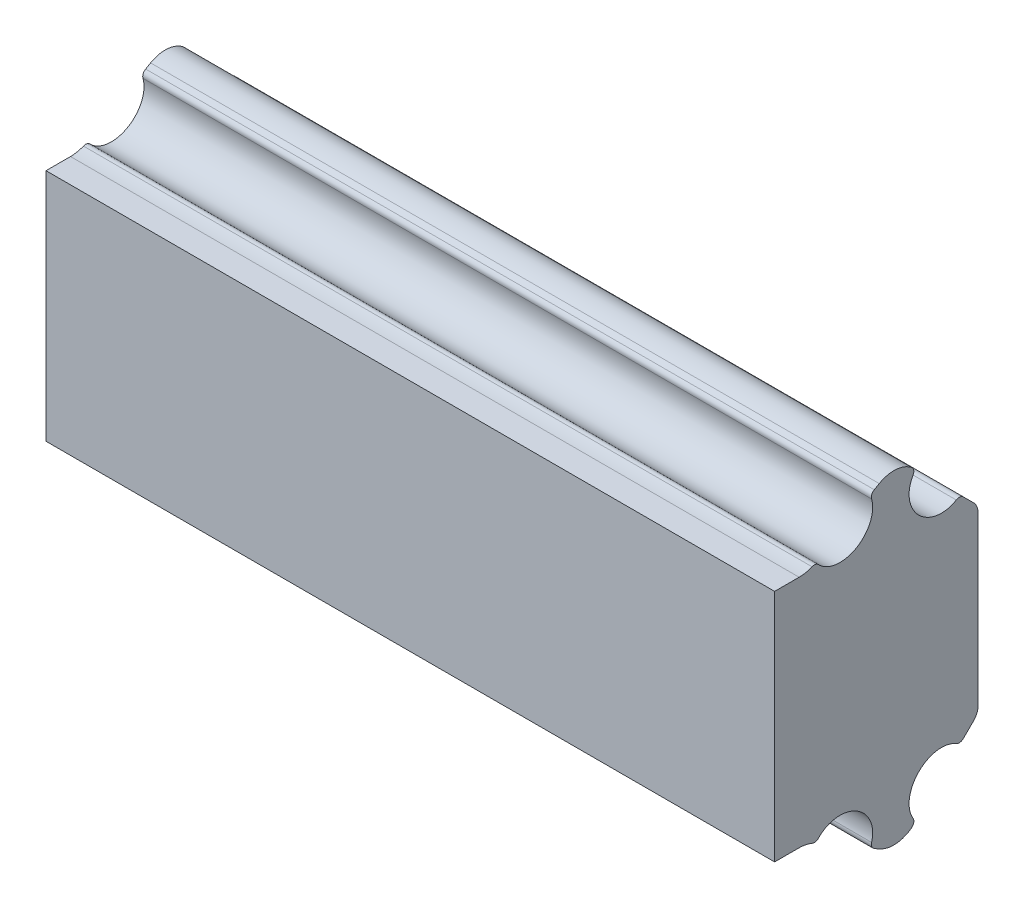
ISO-10303-21;
HEADER;
FILE_DESCRIPTION(('STEP AP214'),'2;1');
FILE_NAME('part.step','',(''),(''),'','','');
FILE_SCHEMA(('AUTOMOTIVE_DESIGN { 1 0 10303 214 1 1 1 1 }'));
ENDSEC;
DATA;
#1=APPLICATION_CONTEXT('core data for automotive mechanical design processes');
#2=APPLICATION_PROTOCOL_DEFINITION('international standard','automotive_design',2000,#1);
#3=PRODUCT_CONTEXT('',#1,'mechanical');
#4=PRODUCT('Part','Part','',(#3));
#5=PRODUCT_RELATED_PRODUCT_CATEGORY('part','',(#4));
#6=PRODUCT_DEFINITION_FORMATION('','',#4);
#7=PRODUCT_DEFINITION_CONTEXT('part definition',#1,'design');
#8=PRODUCT_DEFINITION('design','',#6,#7);
#9=PRODUCT_DEFINITION_SHAPE('','',#8);
#10=(LENGTH_UNIT() NAMED_UNIT(*) SI_UNIT(.MILLI.,.METRE.));
#11=(NAMED_UNIT(*) PLANE_ANGLE_UNIT() SI_UNIT($,.RADIAN.));
#12=(NAMED_UNIT(*) SI_UNIT($,.STERADIAN.) SOLID_ANGLE_UNIT());
#13=UNCERTAINTY_MEASURE_WITH_UNIT(LENGTH_MEASURE(1.E-05),#10,'distance_accuracy_value','');
#14=(GEOMETRIC_REPRESENTATION_CONTEXT(3) GLOBAL_UNCERTAINTY_ASSIGNED_CONTEXT((#13)) GLOBAL_UNIT_ASSIGNED_CONTEXT((#10,
#11,#12)) REPRESENTATION_CONTEXT('',''));
#15=CARTESIAN_POINT('',(0.,0.,0.));
#16=DIRECTION('',(0.,0.,1.));
#17=DIRECTION('',(1.,0.,0.));
#18=AXIS2_PLACEMENT_3D('',#15,#16,#17);
#19=CARTESIAN_POINT('',(50.,-9.04038059222874,13.2525126265847));
#20=DIRECTION('',(1.,0.,0.));
#21=DIRECTION('',(0.,-0.707106781186547,0.707106781186548));
#22=AXIS2_PLACEMENT_3D('',#19,#20,#21);
#23=ELLIPSE('',#22,2.15,2.);
#24=DIRECTION('',(-1.,0.,0.));
#25=VECTOR('',#24,1.);
#26=SURFACE_OF_LINEAR_EXTRUSION('',#23,#25);
#27=CARTESIAN_POINT('',(0.,-9.04038059222874,13.2525126265847));
#28=DIRECTION('',(1.,0.,0.));
#29=DIRECTION('',(0.,-0.707106781186547,0.707106781186548));
#30=AXIS2_PLACEMENT_3D('',#27,#28,#29);
#31=ELLIPSE('',#30,2.15,2.);
#32=CARTESIAN_POINT('',(0.,-7.23929566065981,12.0920565054906));
#33=VERTEX_POINT('',#32);
#34=CARTESIAN_POINT('',(0.,-10.1909063938181,15.0595146263512));
#35=VERTEX_POINT('',#34);
#36=EDGE_CURVE('E339',#33,#35,#31,.T.);
#37=ORIENTED_EDGE('',*,*,#36,.F.);
#38=DIRECTION('',(-1.,0.,0.));
#39=VECTOR('',#38,1.);
#40=CARTESIAN_POINT('',(0.,-7.23929566065981,12.0920565054906));
#41=LINE('',#40,#39);
#42=CARTESIAN_POINT('',(50.,-7.23929566065981,12.0920565054906));
#43=VERTEX_POINT('',#42);
#44=EDGE_CURVE('E392',#33,#43,#41,.F.);
#45=ORIENTED_EDGE('',*,*,#44,.T.);
#46=CARTESIAN_POINT('',(50.,-10.1909063938181,15.0595146263512));
#47=VERTEX_POINT('',#46);
#48=EDGE_CURVE('E367',#43,#47,#23,.T.);
#49=ORIENTED_EDGE('',*,*,#48,.T.);
#50=DIRECTION('',(-1.,0.,0.));
#51=VECTOR('',#50,1.);
#52=CARTESIAN_POINT('',(50.,-10.1909063938181,15.0595146263512));
#53=LINE('',#52,#51);
#54=EDGE_CURVE('E389',#47,#35,#53,.T.);
#55=ORIENTED_EDGE('',*,*,#54,.T.);
#56=EDGE_LOOP('',(#37,#45,#49,#55));
#57=FACE_BOUND('',#56,.T.);
#58=ADVANCED_FACE('F45',(#57),#26,.T.);
#59=CARTESIAN_POINT('',(50.,2.21213203435598,2.21213203435599));
#60=DIRECTION('',(0.,-0.707106781186546,-0.707106781186549));
#61=DIRECTION('',(0.,0.707106781186549,-0.707106781186546));
#62=AXIS2_PLACEMENT_3D('',#59,#60,#61);
#63=PLANE('',#62);
#64=DIRECTION('',(0.,-0.707106781186549,0.707106781186546));
#65=VECTOR('',#64,1.);
#66=CARTESIAN_POINT('',(50.,2.21213203435598,2.21213203435599));
#67=LINE('',#66,#65);
#68=CARTESIAN_POINT('',(50.,-6.46862915010153,10.8928932188135));
#69=VERTEX_POINT('',#68);
#70=CARTESIAN_POINT('',(50.,-7.17914503513132,11.6034091038433));
#71=VERTEX_POINT('',#70);
#72=EDGE_CURVE('E426',#69,#71,#67,.T.);
#73=ORIENTED_EDGE('',*,*,#72,.T.);
#74=DIRECTION('',(-1.,0.,0.));
#75=VECTOR('',#74,1.);
#76=CARTESIAN_POINT('',(50.,-7.17914503513132,11.6034091038432));
#77=LINE('',#76,#75);
#78=CARTESIAN_POINT('',(0.,-7.17914503513132,11.6034091038433));
#79=VERTEX_POINT('',#78);
#80=EDGE_CURVE('E378',#71,#79,#77,.T.);
#81=ORIENTED_EDGE('',*,*,#80,.T.);
#82=DIRECTION('',(0.,-0.707106781186549,0.707106781186546));
#83=VECTOR('',#82,1.);
#84=CARTESIAN_POINT('',(0.,2.21213203435598,2.21213203435599));
#85=LINE('',#84,#83);
#86=CARTESIAN_POINT('',(0.,-6.46862915010153,10.8928932188135));
#87=VERTEX_POINT('',#86);
#88=EDGE_CURVE('E342',#87,#79,#85,.T.);
#89=ORIENTED_EDGE('',*,*,#88,.F.);
#90=DIRECTION('',(-1.,0.,0.));
#91=VECTOR('',#90,1.);
#92=CARTESIAN_POINT('',(50.,-6.46862915010153,10.8928932188135));
#93=LINE('',#92,#91);
#94=EDGE_CURVE('E376',#69,#87,#93,.T.);
#95=ORIENTED_EDGE('',*,*,#94,.F.);
#96=EDGE_LOOP('',(#73,#81,#89,#95));
#97=FACE_BOUND('',#96,.T.);
#98=ADVANCED_FACE('F439',(#97),#63,.T.);
#99=CARTESIAN_POINT('',(50.,-5.76152236891497,11.6));
#100=DIRECTION('',(-1.,0.,0.));
#101=DIRECTION('',(0.,0.,1.));
#102=AXIS2_PLACEMENT_3D('',#99,#100,#101);
#103=CYLINDRICAL_SURFACE('',#102,1.);
#104=CARTESIAN_POINT('',(0.,-5.76152236891497,11.6));
#105=DIRECTION('',(1.,0.,0.));
#106=DIRECTION('',(0.,0.,-1.));
#107=AXIS2_PLACEMENT_3D('',#104,#105,#106);
#108=CIRCLE('',#107,1.);
#109=CARTESIAN_POINT('',(0.,-5.76152236891497,10.6));
#110=VERTEX_POINT('',#109);
#111=EDGE_CURVE('E346',#110,#87,#108,.F.);
#112=ORIENTED_EDGE('',*,*,#111,.F.);
#113=DIRECTION('',(-1.,0.,0.));
#114=VECTOR('',#113,1.);
#115=CARTESIAN_POINT('',(50.,-5.76152236891497,10.6));
#116=LINE('',#115,#114);
#117=CARTESIAN_POINT('',(50.,-5.76152236891497,10.6));
#118=VERTEX_POINT('',#117);
#119=EDGE_CURVE('E374',#118,#110,#116,.T.);
#120=ORIENTED_EDGE('',*,*,#119,.F.);
#121=CARTESIAN_POINT('',(50.,-5.76152236891497,11.6));
#122=DIRECTION('',(1.,0.,0.));
#123=DIRECTION('',(0.,0.,-1.));
#124=AXIS2_PLACEMENT_3D('',#121,#122,#123);
#125=CIRCLE('',#124,1.);
#126=EDGE_CURVE('E429',#118,#69,#125,.F.);
#127=ORIENTED_EDGE('',*,*,#126,.T.);
#128=ORIENTED_EDGE('',*,*,#94,.T.);
#129=EDGE_LOOP('',(#112,#120,#127,#128));
#130=FACE_BOUND('',#129,.T.);
#131=ADVANCED_FACE('F664',(#130),#103,.T.);
#132=CARTESIAN_POINT('',(50.,0.,10.6));
#133=DIRECTION('',(0.,0.,-1.));
#134=DIRECTION('',(-1.,0.,0.));
#135=AXIS2_PLACEMENT_3D('',#132,#133,#134);
#136=PLANE('',#135);
#137=DIRECTION('',(0.,-1.,0.));
#138=VECTOR('',#137,1.);
#139=CARTESIAN_POINT('',(0.,0.,10.6));
#140=LINE('',#139,#138);
#141=CARTESIAN_POINT('',(0.,5.76152236891497,10.6));
#142=VERTEX_POINT('',#141);
#143=EDGE_CURVE('E349',#142,#110,#140,.T.);
#144=ORIENTED_EDGE('',*,*,#143,.F.);
#145=DIRECTION('',(-1.,0.,0.));
#146=VECTOR('',#145,1.);
#147=CARTESIAN_POINT('',(50.,5.76152236891497,10.6));
#148=LINE('',#147,#146);
#149=CARTESIAN_POINT('',(50.,5.76152236891497,10.6));
#150=VERTEX_POINT('',#149);
#151=EDGE_CURVE('E243',#150,#142,#148,.T.);
#152=ORIENTED_EDGE('',*,*,#151,.F.);
#153=DIRECTION('',(0.,-1.,0.));
#154=VECTOR('',#153,1.);
#155=CARTESIAN_POINT('',(50.,0.,10.6));
#156=LINE('',#155,#154);
#157=EDGE_CURVE('E228',#150,#118,#156,.T.);
#158=ORIENTED_EDGE('',*,*,#157,.T.);
#159=ORIENTED_EDGE('',*,*,#119,.T.);
#160=EDGE_LOOP('',(#144,#152,#158,#159));
#161=FACE_BOUND('',#160,.T.);
#162=ADVANCED_FACE('F656',(#161),#136,.T.);
#163=CARTESIAN_POINT('',(50.,0.,24.5558641755391));
#164=DIRECTION('',(0.,0.,1.));
#165=DIRECTION('',(1.,0.,0.));
#166=AXIS2_PLACEMENT_3D('',#163,#164,#165);
#167=PLANE('',#166);
#168=DIRECTION('',(0.,1.,0.));
#169=VECTOR('',#168,1.);
#170=CARTESIAN_POINT('',(0.,0.,24.5558641755391));
#171=LINE('',#170,#169);
#172=CARTESIAN_POINT('',(0.,-8.04065123034669,24.5558641755391));
#173=VERTEX_POINT('',#172);
#174=CARTESIAN_POINT('',(0.,8.04065123034669,24.5558641755391));
#175=VERTEX_POINT('',#174);
#176=EDGE_CURVE('E352',#173,#175,#171,.T.);
#177=ORIENTED_EDGE('',*,*,#176,.F.);
#178=DIRECTION('',(-1.,0.,0.));
#179=VECTOR('',#178,1.);
#180=CARTESIAN_POINT('',(50.,-8.04065123034669,24.5558641755391));
#181=LINE('',#180,#179);
#182=CARTESIAN_POINT('',(50.,-8.04065123034669,24.5558641755391));
#183=VERTEX_POINT('',#182);
#184=EDGE_CURVE('E372',#183,#173,#181,.T.);
#185=ORIENTED_EDGE('',*,*,#184,.F.);
#186=DIRECTION('',(0.,1.,0.));
#187=VECTOR('',#186,1.);
#188=CARTESIAN_POINT('',(50.,0.,24.5558641755391));
#189=LINE('',#188,#187);
#190=CARTESIAN_POINT('',(50.,8.04065123034669,24.5558641755391));
#191=VERTEX_POINT('',#190);
#192=EDGE_CURVE('E480',#183,#191,#189,.T.);
#193=ORIENTED_EDGE('',*,*,#192,.T.);
#194=DIRECTION('',(-1.,0.,0.));
#195=VECTOR('',#194,1.);
#196=CARTESIAN_POINT('',(50.,8.04065123034669,24.5558641755391));
#197=LINE('',#196,#195);
#198=EDGE_CURVE('E473',#191,#175,#197,.T.);
#199=ORIENTED_EDGE('',*,*,#198,.T.);
#200=EDGE_LOOP('',(#177,#185,#193,#199));
#201=FACE_BOUND('',#200,.T.);
#202=ADVANCED_FACE('F478',(#201),#167,.T.);
#203=CARTESIAN_POINT('',(50.,-8.04065123034671,0.));
#204=DIRECTION('',(0.,-1.,0.));
#205=DIRECTION('',(0.,0.,-1.));
#206=AXIS2_PLACEMENT_3D('',#203,#204,#205);
#207=PLANE('',#206);
#208=DIRECTION('',(0.,0.,1.));
#209=VECTOR('',#208,1.);
#210=CARTESIAN_POINT('',(0.,-8.04065123034671,0.));
#211=LINE('',#210,#209);
#212=CARTESIAN_POINT('',(0.,-8.04065123034669,22.8740763765164));
#213=VERTEX_POINT('',#212);
#214=EDGE_CURVE('E354',#213,#173,#211,.T.);
#215=ORIENTED_EDGE('',*,*,#214,.F.);
#216=DIRECTION('',(-1.,0.,0.));
#217=VECTOR('',#216,1.);
#218=CARTESIAN_POINT('',(50.,-8.04065123034669,22.8740763765164));
#219=LINE('',#218,#217);
#220=CARTESIAN_POINT('',(50.,-8.04065123034669,22.8740763765164));
#221=VERTEX_POINT('',#220);
#222=EDGE_CURVE('E369',#221,#213,#219,.T.);
#223=ORIENTED_EDGE('',*,*,#222,.F.);
#224=DIRECTION('',(0.,0.,1.));
#225=VECTOR('',#224,1.);
#226=CARTESIAN_POINT('',(50.,-8.04065123034671,0.));
#227=LINE('',#226,#225);
#228=EDGE_CURVE('E714',#221,#183,#227,.T.);
#229=ORIENTED_EDGE('',*,*,#228,.T.);
#230=ORIENTED_EDGE('',*,*,#184,.T.);
#231=EDGE_LOOP('',(#215,#223,#229,#230));
#232=FACE_BOUND('',#231,.T.);
#233=ADVANCED_FACE('F462',(#232),#207,.T.);
#234=CARTESIAN_POINT('',(50.,-10.3406512303466,22.8740763765164));
#235=DIRECTION('',(-1.,0.,0.));
#236=DIRECTION('',(0.,0.,1.));
#237=AXIS2_PLACEMENT_3D('',#234,#235,#236);
#238=CYLINDRICAL_SURFACE('',#237,2.29999999999992);
#239=CARTESIAN_POINT('',(0.,-10.3406512303466,22.8740763765164));
#240=DIRECTION('',(1.,0.,0.));
#241=DIRECTION('',(0.,0.,-1.));
#242=AXIS2_PLACEMENT_3D('',#239,#240,#241);
#243=CIRCLE('',#242,2.29999999999992);
#244=CARTESIAN_POINT('',(0.,-8.2186352838763,21.9869189367542));
#245=VERTEX_POINT('',#244);
#246=EDGE_CURVE('E357',#245,#213,#243,.T.);
#247=ORIENTED_EDGE('',*,*,#246,.F.);
#248=DIRECTION('',(-1.,0.,0.));
#249=VECTOR('',#248,1.);
#250=CARTESIAN_POINT('',(50.,-8.2186352838763,21.9869189367542));
#251=LINE('',#250,#249);
#252=CARTESIAN_POINT('',(50.,-8.2186352838763,21.9869189367542));
#253=VERTEX_POINT('',#252);
#254=EDGE_CURVE('E11',#245,#253,#251,.F.);
#255=ORIENTED_EDGE('',*,*,#254,.T.);
#256=CARTESIAN_POINT('',(50.,-10.3406512303466,22.8740763765164));
#257=DIRECTION('',(1.,0.,0.));
#258=DIRECTION('',(0.,0.,-1.));
#259=AXIS2_PLACEMENT_3D('',#256,#257,#258);
#260=CIRCLE('',#259,2.29999999999992);
#261=EDGE_CURVE('E333',#253,#221,#260,.T.);
#262=ORIENTED_EDGE('',*,*,#261,.T.);
#263=ORIENTED_EDGE('',*,*,#222,.T.);
#264=EDGE_LOOP('',(#247,#255,#262,#263));
#265=FACE_BOUND('',#264,.T.);
#266=ADVANCED_FACE('F324',(#265),#238,.F.);
#267=CARTESIAN_POINT('',(50.,-9.55066891100103,19.9423658907042));
#268=DIRECTION('',(1.,0.,0.));
#269=DIRECTION('',(0.,-0.500000000000003,-0.866025403784437));
#270=AXIS2_PLACEMENT_3D('',#267,#268,#269);
#271=ELLIPSE('',#270,2.15,2.);
#272=DIRECTION('',(-1.,0.,0.));
#273=VECTOR('',#272,1.);
#274=SURFACE_OF_LINEAR_EXTRUSION('',#271,#273);
#275=CARTESIAN_POINT('',(0.,-9.55066891100103,19.9423658907042));
#276=DIRECTION('',(1.,0.,0.));
#277=DIRECTION('',(0.,-0.500000000000003,-0.866025403784437));
#278=AXIS2_PLACEMENT_3D('',#275,#276,#277);
#279=ELLIPSE('',#278,2.15,2.);
#280=CARTESIAN_POINT('',(0.,-10.2054283665038,17.9023032948167));
#281=VERTEX_POINT('',#280);
#282=CARTESIAN_POINT('',(0.,-8.12476709872118,21.5423256196299));
#283=VERTEX_POINT('',#282);
#284=EDGE_CURVE('E359',#281,#283,#279,.T.);
#285=ORIENTED_EDGE('',*,*,#284,.F.);
#286=DIRECTION('',(-1.,0.,0.));
#287=VECTOR('',#286,1.);
#288=CARTESIAN_POINT('',(0.,-10.2054283665038,17.9023032948167));
#289=LINE('',#288,#287);
#290=CARTESIAN_POINT('',(50.,-10.2054283665038,17.9023032948167));
#291=VERTEX_POINT('',#290);
#292=EDGE_CURVE('E53',#281,#291,#289,.F.);
#293=ORIENTED_EDGE('',*,*,#292,.T.);
#294=CARTESIAN_POINT('',(50.,-8.12476709872118,21.5423256196299));
#295=VERTEX_POINT('',#294);
#296=EDGE_CURVE('E327',#291,#295,#271,.T.);
#297=ORIENTED_EDGE('',*,*,#296,.T.);
#298=DIRECTION('',(-1.,0.,0.));
#299=VECTOR('',#298,1.);
#300=CARTESIAN_POINT('',(50.,-8.12476709872118,21.5423256196299));
#301=LINE('',#300,#299);
#302=EDGE_CURVE('E405',#295,#283,#301,.T.);
#303=ORIENTED_EDGE('',*,*,#302,.T.);
#304=EDGE_LOOP('',(#285,#293,#297,#303));
#305=FACE_BOUND('',#304,.T.);
#306=ADVANCED_FACE('F319',(#305),#274,.T.);
#307=CARTESIAN_POINT('',(50.,-15.6683956091401,9.04615242270848));
#308=DIRECTION('',(0.,-0.866025403784393,0.500000000000078));
#309=DIRECTION('',(0.,-0.500000000000078,-0.866025403784393));
#310=AXIS2_PLACEMENT_3D('',#307,#308,#309);
#311=PLANE('',#310);
#312=DIRECTION('',(0.,0.500000000000078,0.866025403784393));
#313=VECTOR('',#312,1.);
#314=CARTESIAN_POINT('',(50.,-15.6683956091401,9.04615242270848));
#315=LINE('',#314,#313);
#316=CARTESIAN_POINT('',(50.,-10.8577663426889,17.3784067285781));
#317=VERTEX_POINT('',#316);
#318=CARTESIAN_POINT('',(50.,-10.6618573842424,17.7177309982652));
#319=VERTEX_POINT('',#318);
#320=EDGE_CURVE('E332',#317,#319,#315,.T.);
#321=ORIENTED_EDGE('',*,*,#320,.T.);
#322=DIRECTION('',(-1.,0.,0.));
#323=VECTOR('',#322,1.);
#324=CARTESIAN_POINT('',(50.,-10.6618573842424,17.7177309982652));
#325=LINE('',#324,#323);
#326=CARTESIAN_POINT('',(0.,-10.6618573842424,17.7177309982652));
#327=VERTEX_POINT('',#326);
#328=EDGE_CURVE('E402',#319,#327,#325,.T.);
#329=ORIENTED_EDGE('',*,*,#328,.T.);
#330=DIRECTION('',(0.,0.500000000000078,0.866025403784393));
#331=VECTOR('',#330,1.);
#332=CARTESIAN_POINT('',(0.,-15.6683956091401,9.04615242270848));
#333=LINE('',#332,#331);
#334=CARTESIAN_POINT('',(0.,-10.8577663426889,17.3784067285781));
#335=VERTEX_POINT('',#334);
#336=EDGE_CURVE('E362',#335,#327,#333,.T.);
#337=ORIENTED_EDGE('',*,*,#336,.F.);
#338=DIRECTION('',(-1.,0.,0.));
#339=VECTOR('',#338,1.);
#340=CARTESIAN_POINT('',(50.,-10.8577663426889,17.3784067285781));
#341=LINE('',#340,#339);
#342=EDGE_CURVE('E338',#317,#335,#341,.T.);
#343=ORIENTED_EDGE('',*,*,#342,.F.);
#344=EDGE_LOOP('',(#321,#329,#337,#343));
#345=FACE_BOUND('',#344,.T.);
#346=ADVANCED_FACE('F316',(#345),#311,.T.);
#347=CARTESIAN_POINT('',(50.,-9.12571553511999,16.3784067285781));
#348=DIRECTION('',(-1.,0.,0.));
#349=DIRECTION('',(0.,0.,1.));
#350=AXIS2_PLACEMENT_3D('',#347,#348,#349);
#351=CYLINDRICAL_SURFACE('',#350,1.99999999999999);
#352=CARTESIAN_POINT('',(0.,-9.12571553511999,16.3784067285781));
#353=DIRECTION('',(1.,0.,0.));
#354=DIRECTION('',(0.,0.,-1.));
#355=AXIS2_PLACEMENT_3D('',#352,#353,#354);
#356=CIRCLE('',#355,1.99999999999999);
#357=CARTESIAN_POINT('',(0.,-10.7118236223305,15.1601041653019));
#358=VERTEX_POINT('',#357);
#359=EDGE_CURVE('E365',#335,#358,#356,.T.);
#360=ORIENTED_EDGE('',*,*,#359,.T.);
#361=DIRECTION('',(-1.,0.,0.));
#362=VECTOR('',#361,1.);
#363=CARTESIAN_POINT('',(50.,-10.7118236223305,15.1601041653019));
#364=LINE('',#363,#362);
#365=CARTESIAN_POINT('',(50.,-10.7118236223305,15.1601041653019));
#366=VERTEX_POINT('',#365);
#367=EDGE_CURVE('E60',#358,#366,#364,.F.);
#368=ORIENTED_EDGE('',*,*,#367,.T.);
#369=CARTESIAN_POINT('',(50.,-9.12571553511999,16.3784067285781));
#370=DIRECTION('',(1.,0.,0.));
#371=DIRECTION('',(0.,0.,-1.));
#372=AXIS2_PLACEMENT_3D('',#369,#370,#371);
#373=CIRCLE('',#372,1.99999999999999);
#374=EDGE_CURVE('E336',#317,#366,#373,.T.);
#375=ORIENTED_EDGE('',*,*,#374,.F.);
#376=ORIENTED_EDGE('',*,*,#342,.T.);
#377=EDGE_LOOP('',(#360,#368,#375,#376));
#378=FACE_BOUND('',#377,.T.);
#379=ADVANCED_FACE('F309',(#378),#351,.T.);
#380=CARTESIAN_POINT('',(50.,0.,0.));
#381=DIRECTION('',(1.,0.,0.));
#382=DIRECTION('',(0.,0.,-1.));
#383=AXIS2_PLACEMENT_3D('',#380,#381,#382);
#384=PLANE('',#383);
#385=ORIENTED_EDGE('',*,*,#48,.F.);
#386=CARTESIAN_POINT('',(50.,-6.89630232265671,11.8862518163179));
#387=DIRECTION('',(1.,0.,0.));
#388=DIRECTION('',(0.,0.,-1.));
#389=AXIS2_PLACEMENT_3D('',#386,#387,#388);
#390=CIRCLE('',#389,0.4);
#391=EDGE_CURVE('E399',#43,#71,#390,.T.);
#392=ORIENTED_EDGE('',*,*,#391,.T.);
#393=ORIENTED_EDGE('',*,*,#72,.F.);
#394=ORIENTED_EDGE('',*,*,#126,.F.);
#395=ORIENTED_EDGE('',*,*,#157,.F.);
#396=CARTESIAN_POINT('',(50.,5.76152236891497,11.6));
#397=DIRECTION('',(-1.,0.,0.));
#398=DIRECTION('',(0.,0.,-1.));
#399=AXIS2_PLACEMENT_3D('',#396,#397,#398);
#400=CIRCLE('',#399,1.);
#401=CARTESIAN_POINT('',(50.,6.46862915010153,10.8928932188135));
#402=VERTEX_POINT('',#401);
#403=EDGE_CURVE('E220',#150,#402,#400,.F.);
#404=ORIENTED_EDGE('',*,*,#403,.T.);
#405=DIRECTION('',(0.,0.707106781186549,0.707106781186546));
#406=VECTOR('',#405,1.);
#407=CARTESIAN_POINT('',(50.,-2.21213203435598,2.21213203435599));
#408=LINE('',#407,#406);
#409=CARTESIAN_POINT('',(50.,7.17914503513132,11.6034091038433));
#410=VERTEX_POINT('',#409);
#411=EDGE_CURVE('E225',#402,#410,#408,.T.);
#412=ORIENTED_EDGE('',*,*,#411,.T.);
#413=CARTESIAN_POINT('',(50.,6.89630232265671,11.8862518163179));
#414=DIRECTION('',(-1.,0.,0.));
#415=DIRECTION('',(0.,0.,-1.));
#416=AXIS2_PLACEMENT_3D('',#413,#414,#415);
#417=CIRCLE('',#416,0.4);
#418=CARTESIAN_POINT('',(50.,7.23929566065981,12.0920565054906));
#419=VERTEX_POINT('',#418);
#420=EDGE_CURVE('E508',#419,#410,#417,.T.);
#421=ORIENTED_EDGE('',*,*,#420,.F.);
#422=CARTESIAN_POINT('',(50.,9.04038059222874,13.2525126265847));
#423=DIRECTION('',(-1.,0.,0.));
#424=DIRECTION('',(0.,0.707106781186547,0.707106781186548));
#425=AXIS2_PLACEMENT_3D('',#422,#423,#424);
#426=ELLIPSE('',#425,2.15,2.);
#427=CARTESIAN_POINT('',(50.,10.1909063938181,15.0595146263512));
#428=VERTEX_POINT('',#427);
#429=EDGE_CURVE('E248',#419,#428,#426,.T.);
#430=ORIENTED_EDGE('',*,*,#429,.T.);
#431=CARTESIAN_POINT('',(50.,10.3946020048884,15.4037646779572));
#432=DIRECTION('',(-1.,0.,0.));
#433=DIRECTION('',(0.,0.,-1.));
#434=AXIS2_PLACEMENT_3D('',#431,#432,#433);
#435=CIRCLE('',#434,0.4);
#436=CARTESIAN_POINT('',(50.,10.7118236223305,15.1601041653019));
#437=VERTEX_POINT('',#436);
#438=EDGE_CURVE('E506',#437,#428,#435,.T.);
#439=ORIENTED_EDGE('',*,*,#438,.F.);
#440=CARTESIAN_POINT('',(50.,9.12571553511999,16.3784067285781));
#441=DIRECTION('',(-1.,0.,0.));
#442=DIRECTION('',(0.,0.,-1.));
#443=AXIS2_PLACEMENT_3D('',#440,#441,#442);
#444=CIRCLE('',#443,1.99999999999999);
#445=CARTESIAN_POINT('',(50.,10.8577663426889,17.3784067285781));
#446=VERTEX_POINT('',#445);
#447=EDGE_CURVE('E538',#446,#437,#444,.T.);
#448=ORIENTED_EDGE('',*,*,#447,.F.);
#449=DIRECTION('',(0.,-0.500000000000078,0.866025403784393));
#450=VECTOR('',#449,1.);
#451=CARTESIAN_POINT('',(50.,15.6683956091401,9.04615242270848));
#452=LINE('',#451,#450);
#453=CARTESIAN_POINT('',(50.,10.6618573842424,17.7177309982652));
#454=VERTEX_POINT('',#453);
#455=EDGE_CURVE('E263',#446,#454,#452,.T.);
#456=ORIENTED_EDGE('',*,*,#455,.T.);
#457=CARTESIAN_POINT('',(50.,10.3154472227287,17.5177309982651));
#458=DIRECTION('',(-1.,0.,0.));
#459=DIRECTION('',(0.,0.,-1.));
#460=AXIS2_PLACEMENT_3D('',#457,#458,#459);
#461=CIRCLE('',#460,0.4);
#462=CARTESIAN_POINT('',(50.,10.2054283665038,17.9023032948167));
#463=VERTEX_POINT('',#462);
#464=EDGE_CURVE('E504',#463,#454,#461,.T.);
#465=ORIENTED_EDGE('',*,*,#464,.F.);
#466=CARTESIAN_POINT('',(50.,9.55066891100103,19.9423658907042));
#467=DIRECTION('',(-1.,0.,0.));
#468=DIRECTION('',(0.,0.500000000000003,-0.866025403784437));
#469=AXIS2_PLACEMENT_3D('',#466,#467,#468);
#470=ELLIPSE('',#469,2.15,2.);
#471=CARTESIAN_POINT('',(50.,8.12476709872118,21.5423256196299));
#472=VERTEX_POINT('',#471);
#473=EDGE_CURVE('E259',#463,#472,#470,.T.);
#474=ORIENTED_EDGE('',*,*,#473,.T.);
#475=CARTESIAN_POINT('',(50.,7.84958903231623,21.8326306863608));
#476=DIRECTION('',(-1.,0.,0.));
#477=DIRECTION('',(0.,0.,-1.));
#478=AXIS2_PLACEMENT_3D('',#475,#476,#477);
#479=CIRCLE('',#478,0.4);
#480=CARTESIAN_POINT('',(50.,8.2186352838763,21.9869189367542));
#481=VERTEX_POINT('',#480);
#482=EDGE_CURVE('E502',#481,#472,#479,.T.);
#483=ORIENTED_EDGE('',*,*,#482,.F.);
#484=CARTESIAN_POINT('',(50.,10.3406512303466,22.8740763765164));
#485=DIRECTION('',(-1.,0.,0.));
#486=DIRECTION('',(0.,0.,-1.));
#487=AXIS2_PLACEMENT_3D('',#484,#485,#486);
#488=CIRCLE('',#487,2.29999999999992);
#489=CARTESIAN_POINT('',(50.,8.04065123034669,22.8740763765164));
#490=VERTEX_POINT('',#489);
#491=EDGE_CURVE('E257',#481,#490,#488,.T.);
#492=ORIENTED_EDGE('',*,*,#491,.T.);
#493=DIRECTION('',(0.,0.,1.));
#494=VECTOR('',#493,1.);
#495=CARTESIAN_POINT('',(50.,8.04065123034671,0.));
#496=LINE('',#495,#494);
#497=EDGE_CURVE('E232',#490,#191,#496,.T.);
#498=ORIENTED_EDGE('',*,*,#497,.T.);
#499=ORIENTED_EDGE('',*,*,#192,.F.);
#500=ORIENTED_EDGE('',*,*,#228,.F.);
#501=ORIENTED_EDGE('',*,*,#261,.F.);
#502=CARTESIAN_POINT('',(50.,-7.84958903231623,21.8326306863608));
#503=DIRECTION('',(1.,0.,0.));
#504=DIRECTION('',(0.,0.,-1.));
#505=AXIS2_PLACEMENT_3D('',#502,#503,#504);
#506=CIRCLE('',#505,0.4);
#507=EDGE_CURVE('E394',#253,#295,#506,.T.);
#508=ORIENTED_EDGE('',*,*,#507,.T.);
#509=ORIENTED_EDGE('',*,*,#296,.F.);
#510=CARTESIAN_POINT('',(50.,-10.3154472227287,17.5177309982651));
#511=DIRECTION('',(1.,0.,0.));
#512=DIRECTION('',(0.,0.,-1.));
#513=AXIS2_PLACEMENT_3D('',#510,#511,#512);
#514=CIRCLE('',#513,0.4);
#515=EDGE_CURVE('E68',#291,#319,#514,.T.);
#516=ORIENTED_EDGE('',*,*,#515,.T.);
#517=ORIENTED_EDGE('',*,*,#320,.F.);
#518=ORIENTED_EDGE('',*,*,#374,.T.);
#519=CARTESIAN_POINT('',(50.,-10.3946020048884,15.4037646779572));
#520=DIRECTION('',(1.,0.,0.));
#521=DIRECTION('',(0.,0.,-1.));
#522=AXIS2_PLACEMENT_3D('',#519,#520,#521);
#523=CIRCLE('',#522,0.4);
#524=EDGE_CURVE('E397',#366,#47,#523,.T.);
#525=ORIENTED_EDGE('',*,*,#524,.T.);
#526=EDGE_LOOP('',(#385,#392,#393,#394,#395,#404,#412,#421,#430,#439,#448,#456,#465,#474,#483,
#492,#498,#499,#500,#501,#508,#509,#516,#517,#518,#525));
#527=FACE_BOUND('',#526,.T.);
#528=ADVANCED_FACE('F223',(#527),#384,.T.);
#529=CARTESIAN_POINT('',(0.,0.,0.));
#530=DIRECTION('',(1.,0.,0.));
#531=DIRECTION('',(0.,0.,-1.));
#532=AXIS2_PLACEMENT_3D('',#529,#530,#531);
#533=PLANE('',#532);
#534=ORIENTED_EDGE('',*,*,#88,.T.);
#535=CARTESIAN_POINT('',(0.,-6.89630232265671,11.8862518163179));
#536=DIRECTION('',(1.,0.,0.));
#537=DIRECTION('',(0.,0.,-1.));
#538=AXIS2_PLACEMENT_3D('',#535,#536,#537);
#539=CIRCLE('',#538,0.4);
#540=EDGE_CURVE('E387',#79,#33,#539,.F.);
#541=ORIENTED_EDGE('',*,*,#540,.T.);
#542=ORIENTED_EDGE('',*,*,#36,.T.);
#543=CARTESIAN_POINT('',(0.,-10.3946020048884,15.4037646779572));
#544=DIRECTION('',(1.,0.,0.));
#545=DIRECTION('',(0.,0.,-1.));
#546=AXIS2_PLACEMENT_3D('',#543,#544,#545);
#547=CIRCLE('',#546,0.4);
#548=EDGE_CURVE('E385',#35,#358,#547,.F.);
#549=ORIENTED_EDGE('',*,*,#548,.T.);
#550=ORIENTED_EDGE('',*,*,#359,.F.);
#551=ORIENTED_EDGE('',*,*,#336,.T.);
#552=CARTESIAN_POINT('',(0.,-10.3154472227287,17.5177309982651));
#553=DIRECTION('',(1.,0.,0.));
#554=DIRECTION('',(0.,0.,-1.));
#555=AXIS2_PLACEMENT_3D('',#552,#553,#554);
#556=CIRCLE('',#555,0.4);
#557=EDGE_CURVE('E383',#327,#281,#556,.F.);
#558=ORIENTED_EDGE('',*,*,#557,.T.);
#559=ORIENTED_EDGE('',*,*,#284,.T.);
#560=CARTESIAN_POINT('',(0.,-7.84958903231623,21.8326306863608));
#561=DIRECTION('',(1.,0.,0.));
#562=DIRECTION('',(0.,0.,-1.));
#563=AXIS2_PLACEMENT_3D('',#560,#561,#562);
#564=CIRCLE('',#563,0.4);
#565=EDGE_CURVE('E381',#283,#245,#564,.F.);
#566=ORIENTED_EDGE('',*,*,#565,.T.);
#567=ORIENTED_EDGE('',*,*,#246,.T.);
#568=ORIENTED_EDGE('',*,*,#214,.T.);
#569=ORIENTED_EDGE('',*,*,#176,.T.);
#570=DIRECTION('',(0.,0.,1.));
#571=VECTOR('',#570,1.);
#572=CARTESIAN_POINT('',(0.,8.04065123034671,0.));
#573=LINE('',#572,#571);
#574=CARTESIAN_POINT('',(0.,8.04065123034669,22.8740763765164));
#575=VERTEX_POINT('',#574);
#576=EDGE_CURVE('E467',#575,#175,#573,.T.);
#577=ORIENTED_EDGE('',*,*,#576,.F.);
#578=CARTESIAN_POINT('',(0.,10.3406512303466,22.8740763765164));
#579=DIRECTION('',(-1.,0.,0.));
#580=DIRECTION('',(0.,0.,-1.));
#581=AXIS2_PLACEMENT_3D('',#578,#579,#580);
#582=CIRCLE('',#581,2.29999999999992);
#583=CARTESIAN_POINT('',(0.,8.2186352838763,21.9869189367542));
#584=VERTEX_POINT('',#583);
#585=EDGE_CURVE('E476',#584,#575,#582,.T.);
#586=ORIENTED_EDGE('',*,*,#585,.F.);
#587=CARTESIAN_POINT('',(0.,7.84958903231623,21.8326306863608));
#588=DIRECTION('',(-1.,0.,0.));
#589=DIRECTION('',(0.,0.,-1.));
#590=AXIS2_PLACEMENT_3D('',#587,#588,#589);
#591=CIRCLE('',#590,0.4);
#592=CARTESIAN_POINT('',(0.,8.12476709872118,21.5423256196299));
#593=VERTEX_POINT('',#592);
#594=EDGE_CURVE('E488',#593,#584,#591,.F.);
#595=ORIENTED_EDGE('',*,*,#594,.F.);
#596=CARTESIAN_POINT('',(0.,9.55066891100103,19.9423658907042));
#597=DIRECTION('',(-1.,0.,0.));
#598=DIRECTION('',(0.,0.500000000000003,-0.866025403784437));
#599=AXIS2_PLACEMENT_3D('',#596,#597,#598);
#600=ELLIPSE('',#599,2.15,2.);
#601=CARTESIAN_POINT('',(0.,10.2054283665038,17.9023032948167));
#602=VERTEX_POINT('',#601);
#603=EDGE_CURVE('E529',#602,#593,#600,.T.);
#604=ORIENTED_EDGE('',*,*,#603,.F.);
#605=CARTESIAN_POINT('',(0.,10.3154472227287,17.5177309982651));
#606=DIRECTION('',(-1.,0.,0.));
#607=DIRECTION('',(0.,0.,-1.));
#608=AXIS2_PLACEMENT_3D('',#605,#606,#607);
#609=CIRCLE('',#608,0.4);
#610=CARTESIAN_POINT('',(0.,10.6618573842424,17.7177309982652));
#611=VERTEX_POINT('',#610);
#612=EDGE_CURVE('E490',#611,#602,#609,.F.);
#613=ORIENTED_EDGE('',*,*,#612,.F.);
#614=DIRECTION('',(0.,-0.500000000000078,0.866025403784393));
#615=VECTOR('',#614,1.);
#616=CARTESIAN_POINT('',(0.,15.6683956091401,9.04615242270848));
#617=LINE('',#616,#615);
#618=CARTESIAN_POINT('',(0.,10.8577663426889,17.3784067285781));
#619=VERTEX_POINT('',#618);
#620=EDGE_CURVE('E530',#619,#611,#617,.T.);
#621=ORIENTED_EDGE('',*,*,#620,.F.);
#622=CARTESIAN_POINT('',(0.,9.12571553511999,16.3784067285781));
#623=DIRECTION('',(-1.,0.,0.));
#624=DIRECTION('',(0.,0.,-1.));
#625=AXIS2_PLACEMENT_3D('',#622,#623,#624);
#626=CIRCLE('',#625,1.99999999999999);
#627=CARTESIAN_POINT('',(0.,10.7118236223305,15.1601041653019));
#628=VERTEX_POINT('',#627);
#629=EDGE_CURVE('E251',#619,#628,#626,.T.);
#630=ORIENTED_EDGE('',*,*,#629,.T.);
#631=CARTESIAN_POINT('',(0.,10.3946020048884,15.4037646779572));
#632=DIRECTION('',(-1.,0.,0.));
#633=DIRECTION('',(0.,0.,-1.));
#634=AXIS2_PLACEMENT_3D('',#631,#632,#633);
#635=CIRCLE('',#634,0.4);
#636=CARTESIAN_POINT('',(0.,10.1909063938181,15.0595146263512));
#637=VERTEX_POINT('',#636);
#638=EDGE_CURVE('E492',#637,#628,#635,.F.);
#639=ORIENTED_EDGE('',*,*,#638,.F.);
#640=CARTESIAN_POINT('',(0.,9.04038059222874,13.2525126265847));
#641=DIRECTION('',(-1.,0.,0.));
#642=DIRECTION('',(0.,0.707106781186547,0.707106781186548));
#643=AXIS2_PLACEMENT_3D('',#640,#641,#642);
#644=ELLIPSE('',#643,2.15,2.);
#645=CARTESIAN_POINT('',(0.,7.23929566065981,12.0920565054906));
#646=VERTEX_POINT('',#645);
#647=EDGE_CURVE('E546',#646,#637,#644,.T.);
#648=ORIENTED_EDGE('',*,*,#647,.F.);
#649=CARTESIAN_POINT('',(0.,6.89630232265671,11.8862518163179));
#650=DIRECTION('',(-1.,0.,0.));
#651=DIRECTION('',(0.,0.,-1.));
#652=AXIS2_PLACEMENT_3D('',#649,#650,#651);
#653=CIRCLE('',#652,0.4);
#654=CARTESIAN_POINT('',(0.,7.17914503513132,11.6034091038433));
#655=VERTEX_POINT('',#654);
#656=EDGE_CURVE('E494',#655,#646,#653,.F.);
#657=ORIENTED_EDGE('',*,*,#656,.F.);
#658=DIRECTION('',(0.,0.707106781186549,0.707106781186546));
#659=VECTOR('',#658,1.);
#660=CARTESIAN_POINT('',(0.,-2.21213203435598,2.21213203435599));
#661=LINE('',#660,#659);
#662=CARTESIAN_POINT('',(0.,6.46862915010153,10.8928932188135));
#663=VERTEX_POINT('',#662);
#664=EDGE_CURVE('E549',#663,#655,#661,.T.);
#665=ORIENTED_EDGE('',*,*,#664,.F.);
#666=CARTESIAN_POINT('',(0.,5.76152236891497,11.6));
#667=DIRECTION('',(-1.,0.,0.));
#668=DIRECTION('',(0.,0.,-1.));
#669=AXIS2_PLACEMENT_3D('',#666,#667,#668);
#670=CIRCLE('',#669,1.);
#671=EDGE_CURVE('E238',#142,#663,#670,.F.);
#672=ORIENTED_EDGE('',*,*,#671,.F.);
#673=ORIENTED_EDGE('',*,*,#143,.T.);
#674=ORIENTED_EDGE('',*,*,#111,.T.);
#675=EDGE_LOOP('',(#534,#541,#542,#549,#550,#551,#558,#559,#566,#567,#568,#569,#577,#586,#595,
#604,#613,#621,#630,#639,#648,#657,#665,#672,#673,#674));
#676=FACE_BOUND('',#675,.T.);
#677=ADVANCED_FACE('F308',(#676),#533,.F.);
#678=CARTESIAN_POINT('',(25.,-6.89630232265671,11.8862518163179));
#679=DIRECTION('',(-1.,0.,0.));
#680=DIRECTION('',(0.,0.,1.));
#681=AXIS2_PLACEMENT_3D('',#678,#679,#680);
#682=CYLINDRICAL_SURFACE('',#681,0.4);
#683=ORIENTED_EDGE('',*,*,#391,.F.);
#684=ORIENTED_EDGE('',*,*,#44,.F.);
#685=ORIENTED_EDGE('',*,*,#540,.F.);
#686=ORIENTED_EDGE('',*,*,#80,.F.);
#687=EDGE_LOOP('',(#683,#684,#685,#686));
#688=FACE_BOUND('',#687,.T.);
#689=ADVANCED_FACE('F312',(#688),#682,.T.);
#690=CARTESIAN_POINT('',(25.,-10.3946020048884,15.4037646779572));
#691=DIRECTION('',(-1.,0.,0.));
#692=DIRECTION('',(0.,0.,1.));
#693=AXIS2_PLACEMENT_3D('',#690,#691,#692);
#694=CYLINDRICAL_SURFACE('',#693,0.4);
#695=ORIENTED_EDGE('',*,*,#524,.F.);
#696=ORIENTED_EDGE('',*,*,#367,.F.);
#697=ORIENTED_EDGE('',*,*,#548,.F.);
#698=ORIENTED_EDGE('',*,*,#54,.F.);
#699=EDGE_LOOP('',(#695,#696,#697,#698));
#700=FACE_BOUND('',#699,.T.);
#701=ADVANCED_FACE('F419',(#700),#694,.T.);
#702=CARTESIAN_POINT('',(25.,-10.3154472227287,17.5177309982651));
#703=DIRECTION('',(-1.,0.,0.));
#704=DIRECTION('',(0.,0.,1.));
#705=AXIS2_PLACEMENT_3D('',#702,#703,#704);
#706=CYLINDRICAL_SURFACE('',#705,0.4);
#707=ORIENTED_EDGE('',*,*,#515,.F.);
#708=ORIENTED_EDGE('',*,*,#292,.F.);
#709=ORIENTED_EDGE('',*,*,#557,.F.);
#710=ORIENTED_EDGE('',*,*,#328,.F.);
#711=EDGE_LOOP('',(#707,#708,#709,#710));
#712=FACE_BOUND('',#711,.T.);
#713=ADVANCED_FACE('F414',(#712),#706,.T.);
#714=CARTESIAN_POINT('',(25.,-7.84958903231623,21.8326306863608));
#715=DIRECTION('',(-1.,0.,0.));
#716=DIRECTION('',(0.,0.,1.));
#717=AXIS2_PLACEMENT_3D('',#714,#715,#716);
#718=CYLINDRICAL_SURFACE('',#717,0.4);
#719=ORIENTED_EDGE('',*,*,#507,.F.);
#720=ORIENTED_EDGE('',*,*,#254,.F.);
#721=ORIENTED_EDGE('',*,*,#565,.F.);
#722=ORIENTED_EDGE('',*,*,#302,.F.);
#723=EDGE_LOOP('',(#719,#720,#721,#722));
#724=FACE_BOUND('',#723,.T.);
#725=ADVANCED_FACE('F47',(#724),#718,.T.);
#726=DIRECTION('',(-1.,0.,0.));
#727=VECTOR('',#726,1.);
#728=SURFACE_OF_LINEAR_EXTRUSION('',#426,#727);
#729=ORIENTED_EDGE('',*,*,#647,.T.);
#730=DIRECTION('',(-1.,0.,0.));
#731=VECTOR('',#730,1.);
#732=CARTESIAN_POINT('',(50.,10.1909063938181,15.0595146263512));
#733=LINE('',#732,#731);
#734=EDGE_CURVE('E496',#428,#637,#733,.T.);
#735=ORIENTED_EDGE('',*,*,#734,.F.);
#736=ORIENTED_EDGE('',*,*,#429,.F.);
#737=DIRECTION('',(-1.,0.,0.));
#738=VECTOR('',#737,1.);
#739=CARTESIAN_POINT('',(0.,7.23929566065981,12.0920565054906));
#740=LINE('',#739,#738);
#741=EDGE_CURVE('E499',#646,#419,#740,.F.);
#742=ORIENTED_EDGE('',*,*,#741,.F.);
#743=EDGE_LOOP('',(#729,#735,#736,#742));
#744=FACE_BOUND('',#743,.T.);
#745=ADVANCED_FACE('F285',(#744),#728,.F.);
#746=CARTESIAN_POINT('',(50.,-2.21213203435598,2.21213203435599));
#747=DIRECTION('',(0.,0.707106781186546,-0.707106781186549));
#748=DIRECTION('',(0.,-0.707106781186549,-0.707106781186546));
#749=AXIS2_PLACEMENT_3D('',#746,#747,#748);
#750=PLANE('',#749);
#751=ORIENTED_EDGE('',*,*,#411,.F.);
#752=DIRECTION('',(-1.,0.,0.));
#753=VECTOR('',#752,1.);
#754=CARTESIAN_POINT('',(50.,6.46862915010153,10.8928932188135));
#755=LINE('',#754,#753);
#756=EDGE_CURVE('E235',#402,#663,#755,.T.);
#757=ORIENTED_EDGE('',*,*,#756,.T.);
#758=ORIENTED_EDGE('',*,*,#664,.T.);
#759=DIRECTION('',(-1.,0.,0.));
#760=VECTOR('',#759,1.);
#761=CARTESIAN_POINT('',(50.,7.17914503513132,11.6034091038432));
#762=LINE('',#761,#760);
#763=EDGE_CURVE('E242',#410,#655,#762,.T.);
#764=ORIENTED_EDGE('',*,*,#763,.F.);
#765=EDGE_LOOP('',(#751,#757,#758,#764));
#766=FACE_BOUND('',#765,.T.);
#767=ADVANCED_FACE('F246',(#766),#750,.T.);
#768=CARTESIAN_POINT('',(50.,5.76152236891497,11.6));
#769=DIRECTION('',(-1.,0.,0.));
#770=DIRECTION('',(0.,0.,1.));
#771=AXIS2_PLACEMENT_3D('',#768,#769,#770);
#772=CYLINDRICAL_SURFACE('',#771,1.);
#773=ORIENTED_EDGE('',*,*,#671,.T.);
#774=ORIENTED_EDGE('',*,*,#756,.F.);
#775=ORIENTED_EDGE('',*,*,#403,.F.);
#776=ORIENTED_EDGE('',*,*,#151,.T.);
#777=EDGE_LOOP('',(#773,#774,#775,#776));
#778=FACE_BOUND('',#777,.T.);
#779=ADVANCED_FACE('F236',(#778),#772,.T.);
#780=CARTESIAN_POINT('',(50.,8.04065123034671,0.));
#781=DIRECTION('',(0.,1.,0.));
#782=DIRECTION('',(0.,0.,-1.));
#783=AXIS2_PLACEMENT_3D('',#780,#781,#782);
#784=PLANE('',#783);
#785=ORIENTED_EDGE('',*,*,#576,.T.);
#786=ORIENTED_EDGE('',*,*,#198,.F.);
#787=ORIENTED_EDGE('',*,*,#497,.F.);
#788=DIRECTION('',(-1.,0.,0.));
#789=VECTOR('',#788,1.);
#790=CARTESIAN_POINT('',(50.,8.04065123034669,22.8740763765164));
#791=LINE('',#790,#789);
#792=EDGE_CURVE('E475',#490,#575,#791,.T.);
#793=ORIENTED_EDGE('',*,*,#792,.T.);
#794=EDGE_LOOP('',(#785,#786,#787,#793));
#795=FACE_BOUND('',#794,.T.);
#796=ADVANCED_FACE('F276',(#795),#784,.T.);
#797=CARTESIAN_POINT('',(50.,10.3406512303466,22.8740763765164));
#798=DIRECTION('',(-1.,0.,0.));
#799=DIRECTION('',(0.,0.,1.));
#800=AXIS2_PLACEMENT_3D('',#797,#798,#799);
#801=CYLINDRICAL_SURFACE('',#800,2.29999999999992);
#802=ORIENTED_EDGE('',*,*,#585,.T.);
#803=ORIENTED_EDGE('',*,*,#792,.F.);
#804=ORIENTED_EDGE('',*,*,#491,.F.);
#805=DIRECTION('',(-1.,0.,0.));
#806=VECTOR('',#805,1.);
#807=CARTESIAN_POINT('',(50.,8.2186352838763,21.9869189367542));
#808=LINE('',#807,#806);
#809=EDGE_CURVE('E343',#584,#481,#808,.F.);
#810=ORIENTED_EDGE('',*,*,#809,.F.);
#811=EDGE_LOOP('',(#802,#803,#804,#810));
#812=FACE_BOUND('',#811,.T.);
#813=ADVANCED_FACE('F271',(#812),#801,.F.);
#814=DIRECTION('',(-1.,0.,0.));
#815=VECTOR('',#814,1.);
#816=SURFACE_OF_LINEAR_EXTRUSION('',#470,#815);
#817=ORIENTED_EDGE('',*,*,#603,.T.);
#818=DIRECTION('',(-1.,0.,0.));
#819=VECTOR('',#818,1.);
#820=CARTESIAN_POINT('',(50.,8.12476709872118,21.5423256196299));
#821=LINE('',#820,#819);
#822=EDGE_CURVE('E516',#472,#593,#821,.T.);
#823=ORIENTED_EDGE('',*,*,#822,.F.);
#824=ORIENTED_EDGE('',*,*,#473,.F.);
#825=DIRECTION('',(-1.,0.,0.));
#826=VECTOR('',#825,1.);
#827=CARTESIAN_POINT('',(0.,10.2054283665038,17.9023032948167));
#828=LINE('',#827,#826);
#829=EDGE_CURVE('E518',#602,#463,#828,.F.);
#830=ORIENTED_EDGE('',*,*,#829,.F.);
#831=EDGE_LOOP('',(#817,#823,#824,#830));
#832=FACE_BOUND('',#831,.T.);
#833=ADVANCED_FACE('F266',(#832),#816,.F.);
#834=CARTESIAN_POINT('',(50.,15.6683956091401,9.04615242270848));
#835=DIRECTION('',(0.,0.866025403784393,0.500000000000078));
#836=DIRECTION('',(0.,0.500000000000078,-0.866025403784393));
#837=AXIS2_PLACEMENT_3D('',#834,#835,#836);
#838=PLANE('',#837);
#839=ORIENTED_EDGE('',*,*,#455,.F.);
#840=DIRECTION('',(-1.,0.,0.));
#841=VECTOR('',#840,1.);
#842=CARTESIAN_POINT('',(50.,10.8577663426889,17.3784067285781));
#843=LINE('',#842,#841);
#844=EDGE_CURVE('E483',#446,#619,#843,.T.);
#845=ORIENTED_EDGE('',*,*,#844,.T.);
#846=ORIENTED_EDGE('',*,*,#620,.T.);
#847=DIRECTION('',(-1.,0.,0.));
#848=VECTOR('',#847,1.);
#849=CARTESIAN_POINT('',(50.,10.6618573842424,17.7177309982652));
#850=LINE('',#849,#848);
#851=EDGE_CURVE('E513',#454,#611,#850,.T.);
#852=ORIENTED_EDGE('',*,*,#851,.F.);
#853=EDGE_LOOP('',(#839,#845,#846,#852));
#854=FACE_BOUND('',#853,.T.);
#855=ADVANCED_FACE('F270',(#854),#838,.T.);
#856=CARTESIAN_POINT('',(50.,9.12571553511999,16.3784067285781));
#857=DIRECTION('',(-1.,0.,0.));
#858=DIRECTION('',(0.,0.,1.));
#859=AXIS2_PLACEMENT_3D('',#856,#857,#858);
#860=CYLINDRICAL_SURFACE('',#859,1.99999999999999);
#861=ORIENTED_EDGE('',*,*,#629,.F.);
#862=ORIENTED_EDGE('',*,*,#844,.F.);
#863=ORIENTED_EDGE('',*,*,#447,.T.);
#864=DIRECTION('',(-1.,0.,0.));
#865=VECTOR('',#864,1.);
#866=CARTESIAN_POINT('',(50.,10.7118236223305,15.1601041653019));
#867=LINE('',#866,#865);
#868=EDGE_CURVE('E510',#628,#437,#867,.F.);
#869=ORIENTED_EDGE('',*,*,#868,.F.);
#870=EDGE_LOOP('',(#861,#862,#863,#869));
#871=FACE_BOUND('',#870,.T.);
#872=ADVANCED_FACE('F293',(#871),#860,.T.);
#873=CARTESIAN_POINT('',(25.,6.89630232265671,11.8862518163179));
#874=DIRECTION('',(-1.,0.,0.));
#875=DIRECTION('',(0.,0.,1.));
#876=AXIS2_PLACEMENT_3D('',#873,#874,#875);
#877=CYLINDRICAL_SURFACE('',#876,0.4);
#878=ORIENTED_EDGE('',*,*,#420,.T.);
#879=ORIENTED_EDGE('',*,*,#763,.T.);
#880=ORIENTED_EDGE('',*,*,#656,.T.);
#881=ORIENTED_EDGE('',*,*,#741,.T.);
#882=EDGE_LOOP('',(#878,#879,#880,#881));
#883=FACE_BOUND('',#882,.T.);
#884=ADVANCED_FACE('F289',(#883),#877,.T.);
#885=CARTESIAN_POINT('',(25.,10.3946020048884,15.4037646779572));
#886=DIRECTION('',(-1.,0.,0.));
#887=DIRECTION('',(0.,0.,1.));
#888=AXIS2_PLACEMENT_3D('',#885,#886,#887);
#889=CYLINDRICAL_SURFACE('',#888,0.4);
#890=ORIENTED_EDGE('',*,*,#438,.T.);
#891=ORIENTED_EDGE('',*,*,#734,.T.);
#892=ORIENTED_EDGE('',*,*,#638,.T.);
#893=ORIENTED_EDGE('',*,*,#868,.T.);
#894=EDGE_LOOP('',(#890,#891,#892,#893));
#895=FACE_BOUND('',#894,.T.);
#896=ADVANCED_FACE('F292',(#895),#889,.T.);
#897=CARTESIAN_POINT('',(25.,10.3154472227287,17.5177309982651));
#898=DIRECTION('',(-1.,0.,0.));
#899=DIRECTION('',(0.,0.,1.));
#900=AXIS2_PLACEMENT_3D('',#897,#898,#899);
#901=CYLINDRICAL_SURFACE('',#900,0.4);
#902=ORIENTED_EDGE('',*,*,#464,.T.);
#903=ORIENTED_EDGE('',*,*,#851,.T.);
#904=ORIENTED_EDGE('',*,*,#612,.T.);
#905=ORIENTED_EDGE('',*,*,#829,.T.);
#906=EDGE_LOOP('',(#902,#903,#904,#905));
#907=FACE_BOUND('',#906,.T.);
#908=ADVANCED_FACE('F297',(#907),#901,.T.);
#909=CARTESIAN_POINT('',(25.,7.84958903231623,21.8326306863608));
#910=DIRECTION('',(-1.,0.,0.));
#911=DIRECTION('',(0.,0.,1.));
#912=AXIS2_PLACEMENT_3D('',#909,#910,#911);
#913=CYLINDRICAL_SURFACE('',#912,0.4);
#914=ORIENTED_EDGE('',*,*,#482,.T.);
#915=ORIENTED_EDGE('',*,*,#822,.T.);
#916=ORIENTED_EDGE('',*,*,#594,.T.);
#917=ORIENTED_EDGE('',*,*,#809,.T.);
#918=EDGE_LOOP('',(#914,#915,#916,#917));
#919=FACE_BOUND('',#918,.T.);
#920=ADVANCED_FACE('F301',(#919),#913,.T.);
#921=CLOSED_SHELL('',(#58,#98,#131,#162,#202,#233,#266,#306,#346,#379,#528,#677,#689,#701,#713,
#725,#745,#767,#779,#796,#813,#833,#855,#872,#884,#896,#908,#920));
#922=MANIFOLD_SOLID_BREP('B2',#921);
#923=ADVANCED_BREP_SHAPE_REPRESENTATION('',(#18,#922),#14);
#924=SHAPE_DEFINITION_REPRESENTATION(#9,#923);
ENDSEC;
END-ISO-10303-21;
